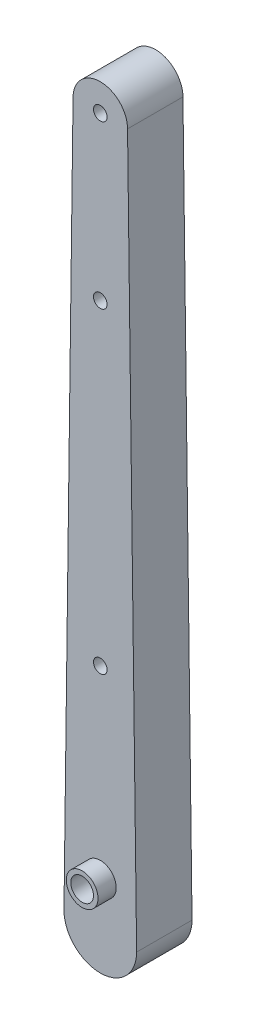
ISO-10303-21;
HEADER;
FILE_DESCRIPTION(('STEP AP214'),'2;1');
FILE_NAME('part.step','',(''),(''),'','','');
FILE_SCHEMA(('AUTOMOTIVE_DESIGN { 1 0 10303 214 1 1 1 1 }'));
ENDSEC;
DATA;
#1=APPLICATION_CONTEXT('core data for automotive mechanical design processes');
#2=APPLICATION_PROTOCOL_DEFINITION('international standard','automotive_design',2000,#1);
#3=PRODUCT_CONTEXT('',#1,'mechanical');
#4=PRODUCT('Part','Part','',(#3));
#5=PRODUCT_RELATED_PRODUCT_CATEGORY('part','',(#4));
#6=PRODUCT_DEFINITION_FORMATION('','',#4);
#7=PRODUCT_DEFINITION_CONTEXT('part definition',#1,'design');
#8=PRODUCT_DEFINITION('design','',#6,#7);
#9=PRODUCT_DEFINITION_SHAPE('','',#8);
#10=(LENGTH_UNIT() NAMED_UNIT(*) SI_UNIT(.MILLI.,.METRE.));
#11=(NAMED_UNIT(*) PLANE_ANGLE_UNIT() SI_UNIT($,.RADIAN.));
#12=(NAMED_UNIT(*) SI_UNIT($,.STERADIAN.) SOLID_ANGLE_UNIT());
#13=UNCERTAINTY_MEASURE_WITH_UNIT(LENGTH_MEASURE(1.E-05),#10,'distance_accuracy_value','');
#14=(GEOMETRIC_REPRESENTATION_CONTEXT(3) GLOBAL_UNCERTAINTY_ASSIGNED_CONTEXT((#13)) GLOBAL_UNIT_ASSIGNED_CONTEXT((#10,
#11,#12)) REPRESENTATION_CONTEXT('',''));
#15=CARTESIAN_POINT('',(0.,0.,0.));
#16=DIRECTION('',(0.,0.,1.));
#17=DIRECTION('',(1.,0.,0.));
#18=AXIS2_PLACEMENT_3D('',#15,#16,#17);
#19=CARTESIAN_POINT('',(0.,-68.,16.2));
#20=DIRECTION('',(0.,0.,1.));
#21=DIRECTION('',(1.,0.,0.));
#22=AXIS2_PLACEMENT_3D('',#19,#20,#21);
#23=PLANE('',#22);
#24=CARTESIAN_POINT('',(0.,-68.,16.2));
#25=DIRECTION('',(0.,0.,1.));
#26=DIRECTION('',(1.,0.,0.));
#27=AXIS2_PLACEMENT_3D('',#24,#25,#26);
#28=CIRCLE('',#27,3.5);
#29=CARTESIAN_POINT('',(3.50000000000002,-68.,16.2));
#30=VERTEX_POINT('',#29);
#31=EDGE_CURVE('E12',#30,#30,#28,.T.);
#32=ORIENTED_EDGE('',*,*,#31,.T.);
#33=EDGE_LOOP('',(#32));
#34=FACE_BOUND('',#33,.T.);
#35=CARTESIAN_POINT('',(0.,-68.,16.2));
#36=DIRECTION('',(0.,0.,1.));
#37=DIRECTION('',(1.,0.,0.));
#38=AXIS2_PLACEMENT_3D('',#35,#36,#37);
#39=CIRCLE('',#38,2.5);
#40=CARTESIAN_POINT('',(2.50000000000002,-68.,16.2));
#41=VERTEX_POINT('',#40);
#42=EDGE_CURVE('E64',#41,#41,#39,.T.);
#43=ORIENTED_EDGE('',*,*,#42,.F.);
#44=EDGE_LOOP('',(#43));
#45=FACE_BOUND('',#44,.T.);
#46=ADVANCED_FACE('F53',(#34,#45),#23,.T.);
#47=CARTESIAN_POINT('',(0.,-68.,12.2));
#48=DIRECTION('',(0.,0.,1.));
#49=DIRECTION('',(1.,0.,0.));
#50=AXIS2_PLACEMENT_3D('',#47,#48,#49);
#51=PLANE('',#50);
#52=CARTESIAN_POINT('',(0.,-68.,12.2));
#53=DIRECTION('',(0.,0.,1.));
#54=DIRECTION('',(1.,0.,0.));
#55=AXIS2_PLACEMENT_3D('',#52,#53,#54);
#56=CIRCLE('',#55,3.5);
#57=CARTESIAN_POINT('',(3.50000000000002,-68.,12.2));
#58=VERTEX_POINT('',#57);
#59=EDGE_CURVE('E57',#58,#58,#56,.T.);
#60=ORIENTED_EDGE('',*,*,#59,.F.);
#61=EDGE_LOOP('',(#60));
#62=FACE_BOUND('',#61,.T.);
#63=CARTESIAN_POINT('',(0.,-68.,12.2));
#64=DIRECTION('',(0.,0.,1.));
#65=DIRECTION('',(1.,0.,0.));
#66=AXIS2_PLACEMENT_3D('',#63,#64,#65);
#67=CIRCLE('',#66,2.5);
#68=CARTESIAN_POINT('',(2.50000000000002,-68.,12.2));
#69=VERTEX_POINT('',#68);
#70=EDGE_CURVE('E66',#69,#69,#67,.T.);
#71=ORIENTED_EDGE('',*,*,#70,.T.);
#72=EDGE_LOOP('',(#71));
#73=FACE_BOUND('',#72,.T.);
#74=ADVANCED_FACE('F76',(#62,#73),#51,.F.);
#75=CARTESIAN_POINT('',(0.,-68.,16.2));
#76=DIRECTION('',(0.,0.,-1.));
#77=DIRECTION('',(-1.,0.,0.));
#78=AXIS2_PLACEMENT_3D('',#75,#76,#77);
#79=CYLINDRICAL_SURFACE('',#78,3.5);
#80=ORIENTED_EDGE('',*,*,#31,.F.);
#81=EDGE_LOOP('',(#80));
#82=FACE_BOUND('',#81,.T.);
#83=ORIENTED_EDGE('',*,*,#59,.T.);
#84=EDGE_LOOP('',(#83));
#85=FACE_BOUND('',#84,.T.);
#86=ADVANCED_FACE('F55',(#82,#85),#79,.T.);
#87=CARTESIAN_POINT('',(0.,-68.,16.2));
#88=DIRECTION('',(0.,0.,-1.));
#89=DIRECTION('',(-1.,0.,0.));
#90=AXIS2_PLACEMENT_3D('',#87,#88,#89);
#91=CYLINDRICAL_SURFACE('',#90,2.5);
#92=ORIENTED_EDGE('',*,*,#42,.T.);
#93=EDGE_LOOP('',(#92));
#94=FACE_BOUND('',#93,.T.);
#95=ORIENTED_EDGE('',*,*,#70,.F.);
#96=EDGE_LOOP('',(#95));
#97=FACE_BOUND('',#96,.T.);
#98=ADVANCED_FACE('F72',(#94,#97),#91,.F.);
#99=CLOSED_SHELL('',(#46,#74,#86,#98));
#100=MANIFOLD_SOLID_BREP('B2',#99);
#101=CARTESIAN_POINT('',(0.,78.,12.2));
#102=DIRECTION('',(0.,0.,1.));
#103=DIRECTION('',(1.,0.,0.));
#104=AXIS2_PLACEMENT_3D('',#101,#102,#103);
#105=PLANE('',#104);
#106=CARTESIAN_POINT('',(0.,42.2627572504078,12.2));
#107=DIRECTION('',(0.,0.,1.));
#108=DIRECTION('',(1.,0.,0.));
#109=AXIS2_PLACEMENT_3D('',#106,#107,#108);
#110=CIRCLE('',#109,1.5);
#111=CARTESIAN_POINT('',(1.5,42.2627572504078,12.2));
#112=VERTEX_POINT('',#111);
#113=EDGE_CURVE('E218',#112,#112,#110,.T.);
#114=ORIENTED_EDGE('',*,*,#113,.F.);
#115=EDGE_LOOP('',(#114));
#116=FACE_BOUND('',#115,.T.);
#117=CARTESIAN_POINT('',(0.,-27.421243353148,12.2));
#118=DIRECTION('',(0.,0.,1.));
#119=DIRECTION('',(1.,0.,0.));
#120=AXIS2_PLACEMENT_3D('',#117,#118,#119);
#121=CIRCLE('',#120,1.5);
#122=CARTESIAN_POINT('',(1.5,-27.421243353148,12.2));
#123=VERTEX_POINT('',#122);
#124=EDGE_CURVE('E225',#123,#123,#121,.T.);
#125=ORIENTED_EDGE('',*,*,#124,.F.);
#126=EDGE_LOOP('',(#125));
#127=FACE_BOUND('',#126,.T.);
#128=CARTESIAN_POINT('',(0.,78.,12.2));
#129=DIRECTION('',(0.,0.,1.));
#130=DIRECTION('',(1.,0.,0.));
#131=AXIS2_PLACEMENT_3D('',#128,#129,#130);
#132=CIRCLE('',#131,1.5);
#133=CARTESIAN_POINT('',(1.5,78.,12.2));
#134=VERTEX_POINT('',#133);
#135=EDGE_CURVE('E188',#134,#134,#132,.T.);
#136=ORIENTED_EDGE('',*,*,#135,.F.);
#137=EDGE_LOOP('',(#136));
#138=FACE_BOUND('',#137,.T.);
#139=CARTESIAN_POINT('',(0.,78.,12.2));
#140=DIRECTION('',(0.,0.,1.));
#141=DIRECTION('',(1.,0.,0.));
#142=AXIS2_PLACEMENT_3D('',#139,#140,#141);
#143=CIRCLE('',#142,6.);
#144=CARTESIAN_POINT('',(6.,78.,12.2));
#145=VERTEX_POINT('',#144);
#146=CARTESIAN_POINT('',(-6.,78.,12.2));
#147=VERTEX_POINT('',#146);
#148=EDGE_CURVE('E168',#145,#147,#143,.T.);
#149=ORIENTED_EDGE('',*,*,#148,.T.);
#150=DIRECTION('',(-0.0128194593250657,-0.999917827355135,0.));
#151=VECTOR('',#150,1.);
#152=CARTESIAN_POINT('',(-6.,78.,12.2));
#153=LINE('',#152,#151);
#154=CARTESIAN_POINT('',(-7.99999999999995,-78.,12.2));
#155=VERTEX_POINT('',#154);
#156=EDGE_CURVE('E163',#147,#155,#153,.T.);
#157=ORIENTED_EDGE('',*,*,#156,.T.);
#158=CARTESIAN_POINT('',(0.,-78.,12.2));
#159=DIRECTION('',(0.,0.,1.));
#160=DIRECTION('',(1.,0.,0.));
#161=AXIS2_PLACEMENT_3D('',#158,#159,#160);
#162=CIRCLE('',#161,8.);
#163=CARTESIAN_POINT('',(8.00000000000002,-78.,12.2));
#164=VERTEX_POINT('',#163);
#165=EDGE_CURVE('E166',#155,#164,#162,.T.);
#166=ORIENTED_EDGE('',*,*,#165,.T.);
#167=DIRECTION('',(-0.012819459325066,0.999917827355135,0.));
#168=VECTOR('',#167,1.);
#169=CARTESIAN_POINT('',(6.,78.,12.2));
#170=LINE('',#169,#168);
#171=EDGE_CURVE('E133',#164,#145,#170,.T.);
#172=ORIENTED_EDGE('',*,*,#171,.T.);
#173=EDGE_LOOP('',(#149,#157,#166,#172));
#174=FACE_BOUND('',#173,.T.);
#175=CARTESIAN_POINT('',(0.,-68.,12.2));
#176=DIRECTION('',(0.,0.,1.));
#177=DIRECTION('',(1.,0.,0.));
#178=AXIS2_PLACEMENT_3D('',#175,#176,#177);
#179=CIRCLE('',#178,2.5);
#180=CARTESIAN_POINT('',(2.50000000000002,-68.,12.2));
#181=VERTEX_POINT('',#180);
#182=EDGE_CURVE('E210',#181,#181,#179,.T.);
#183=ORIENTED_EDGE('',*,*,#182,.F.);
#184=EDGE_LOOP('',(#183));
#185=FACE_BOUND('',#184,.T.);
#186=ADVANCED_FACE('F115',(#116,#127,#138,#174,#185),#105,.T.);
#187=CARTESIAN_POINT('',(0.,78.,0.));
#188=DIRECTION('',(0.,0.,1.));
#189=DIRECTION('',(1.,0.,0.));
#190=AXIS2_PLACEMENT_3D('',#187,#188,#189);
#191=PLANE('',#190);
#192=CARTESIAN_POINT('',(0.,42.2627572504078,0.));
#193=DIRECTION('',(0.,0.,-1.));
#194=DIRECTION('',(-1.,0.,0.));
#195=AXIS2_PLACEMENT_3D('',#192,#193,#194);
#196=CIRCLE('',#195,1.5);
#197=CARTESIAN_POINT('',(-1.5,42.2627572504078,0.));
#198=VERTEX_POINT('',#197);
#199=EDGE_CURVE('E229',#198,#198,#196,.T.);
#200=ORIENTED_EDGE('',*,*,#199,.F.);
#201=EDGE_LOOP('',(#200));
#202=FACE_BOUND('',#201,.T.);
#203=CARTESIAN_POINT('',(0.,-27.421243353148,0.));
#204=DIRECTION('',(0.,0.,-1.));
#205=DIRECTION('',(-1.,0.,0.));
#206=AXIS2_PLACEMENT_3D('',#203,#204,#205);
#207=CIRCLE('',#206,1.5);
#208=CARTESIAN_POINT('',(-1.5,-27.421243353148,0.));
#209=VERTEX_POINT('',#208);
#210=EDGE_CURVE('E230',#209,#209,#207,.T.);
#211=ORIENTED_EDGE('',*,*,#210,.F.);
#212=EDGE_LOOP('',(#211));
#213=FACE_BOUND('',#212,.T.);
#214=CARTESIAN_POINT('',(0.,78.,0.));
#215=DIRECTION('',(0.,0.,1.));
#216=DIRECTION('',(1.,0.,0.));
#217=AXIS2_PLACEMENT_3D('',#214,#215,#216);
#218=CIRCLE('',#217,6.);
#219=CARTESIAN_POINT('',(6.,78.,0.));
#220=VERTEX_POINT('',#219);
#221=CARTESIAN_POINT('',(-6.,78.,0.));
#222=VERTEX_POINT('',#221);
#223=EDGE_CURVE('E184',#220,#222,#218,.T.);
#224=ORIENTED_EDGE('',*,*,#223,.F.);
#225=DIRECTION('',(-0.012819459325066,0.999917827355135,0.));
#226=VECTOR('',#225,1.);
#227=CARTESIAN_POINT('',(6.,78.,0.));
#228=LINE('',#227,#226);
#229=CARTESIAN_POINT('',(8.00000000000002,-78.,0.));
#230=VERTEX_POINT('',#229);
#231=EDGE_CURVE('E156',#230,#220,#228,.T.);
#232=ORIENTED_EDGE('',*,*,#231,.F.);
#233=CARTESIAN_POINT('',(0.,-78.,0.));
#234=DIRECTION('',(0.,0.,1.));
#235=DIRECTION('',(1.,0.,0.));
#236=AXIS2_PLACEMENT_3D('',#233,#234,#235);
#237=CIRCLE('',#236,8.);
#238=CARTESIAN_POINT('',(-7.99999999999995,-78.,0.));
#239=VERTEX_POINT('',#238);
#240=EDGE_CURVE('E150',#239,#230,#237,.T.);
#241=ORIENTED_EDGE('',*,*,#240,.F.);
#242=DIRECTION('',(-0.0128194593250657,-0.999917827355135,0.));
#243=VECTOR('',#242,1.);
#244=CARTESIAN_POINT('',(-6.,78.,0.));
#245=LINE('',#244,#243);
#246=EDGE_CURVE('E173',#222,#239,#245,.T.);
#247=ORIENTED_EDGE('',*,*,#246,.F.);
#248=EDGE_LOOP('',(#224,#232,#241,#247));
#249=FACE_BOUND('',#248,.T.);
#250=CARTESIAN_POINT('',(0.,78.,0.));
#251=DIRECTION('',(0.,0.,1.));
#252=DIRECTION('',(1.,0.,0.));
#253=AXIS2_PLACEMENT_3D('',#250,#251,#252);
#254=CIRCLE('',#253,1.5);
#255=CARTESIAN_POINT('',(1.5,78.,0.));
#256=VERTEX_POINT('',#255);
#257=EDGE_CURVE('E206',#256,#256,#254,.T.);
#258=ORIENTED_EDGE('',*,*,#257,.T.);
#259=EDGE_LOOP('',(#258));
#260=FACE_BOUND('',#259,.T.);
#261=CARTESIAN_POINT('',(0.,-68.,0.));
#262=DIRECTION('',(0.,0.,1.));
#263=DIRECTION('',(1.,0.,0.));
#264=AXIS2_PLACEMENT_3D('',#261,#262,#263);
#265=CIRCLE('',#264,2.5);
#266=CARTESIAN_POINT('',(2.50000000000002,-68.,0.));
#267=VERTEX_POINT('',#266);
#268=EDGE_CURVE('E214',#267,#267,#265,.T.);
#269=ORIENTED_EDGE('',*,*,#268,.T.);
#270=EDGE_LOOP('',(#269));
#271=FACE_BOUND('',#270,.T.);
#272=ADVANCED_FACE('F201',(#202,#213,#249,#260,#271),#191,.F.);
#273=CARTESIAN_POINT('',(0.,78.,12.2));
#274=DIRECTION('',(0.,0.,-1.));
#275=DIRECTION('',(-1.,0.,0.));
#276=AXIS2_PLACEMENT_3D('',#273,#274,#275);
#277=CYLINDRICAL_SURFACE('',#276,6.);
#278=ORIENTED_EDGE('',*,*,#223,.T.);
#279=DIRECTION('',(0.,0.,-1.));
#280=VECTOR('',#279,1.);
#281=CARTESIAN_POINT('',(-6.,78.,12.2));
#282=LINE('',#281,#280);
#283=EDGE_CURVE('E51',#147,#222,#282,.T.);
#284=ORIENTED_EDGE('',*,*,#283,.F.);
#285=ORIENTED_EDGE('',*,*,#148,.F.);
#286=DIRECTION('',(0.,0.,-1.));
#287=VECTOR('',#286,1.);
#288=CARTESIAN_POINT('',(6.,78.,12.2));
#289=LINE('',#288,#287);
#290=EDGE_CURVE('E180',#145,#220,#289,.T.);
#291=ORIENTED_EDGE('',*,*,#290,.T.);
#292=EDGE_LOOP('',(#278,#284,#285,#291));
#293=FACE_BOUND('',#292,.T.);
#294=ADVANCED_FACE('F117',(#293),#277,.T.);
#295=CARTESIAN_POINT('',(-6.,78.,12.2));
#296=DIRECTION('',(0.999917827355135,-0.0128194593250657,0.));
#297=DIRECTION('',(0.0128194593250657,0.999917827355135,0.));
#298=AXIS2_PLACEMENT_3D('',#295,#296,#297);
#299=PLANE('',#298);
#300=ORIENTED_EDGE('',*,*,#246,.T.);
#301=DIRECTION('',(0.,0.,-1.));
#302=VECTOR('',#301,1.);
#303=CARTESIAN_POINT('',(-7.99999999999995,-78.,12.2));
#304=LINE('',#303,#302);
#305=EDGE_CURVE('E125',#155,#239,#304,.T.);
#306=ORIENTED_EDGE('',*,*,#305,.F.);
#307=ORIENTED_EDGE('',*,*,#156,.F.);
#308=ORIENTED_EDGE('',*,*,#283,.T.);
#309=EDGE_LOOP('',(#300,#306,#307,#308));
#310=FACE_BOUND('',#309,.T.);
#311=ADVANCED_FACE('F172',(#310),#299,.F.);
#312=CARTESIAN_POINT('',(0.,-78.,12.2));
#313=DIRECTION('',(0.,0.,-1.));
#314=DIRECTION('',(-1.,0.,0.));
#315=AXIS2_PLACEMENT_3D('',#312,#313,#314);
#316=CYLINDRICAL_SURFACE('',#315,8.);
#317=ORIENTED_EDGE('',*,*,#240,.T.);
#318=DIRECTION('',(0.,0.,-1.));
#319=VECTOR('',#318,1.);
#320=CARTESIAN_POINT('',(8.00000000000002,-78.,12.2));
#321=LINE('',#320,#319);
#322=EDGE_CURVE('E175',#164,#230,#321,.T.);
#323=ORIENTED_EDGE('',*,*,#322,.F.);
#324=ORIENTED_EDGE('',*,*,#165,.F.);
#325=ORIENTED_EDGE('',*,*,#305,.T.);
#326=EDGE_LOOP('',(#317,#323,#324,#325));
#327=FACE_BOUND('',#326,.T.);
#328=ADVANCED_FACE('F176',(#327),#316,.T.);
#329=CARTESIAN_POINT('',(6.,78.,12.2));
#330=DIRECTION('',(-0.999917827355135,-0.012819459325066,0.));
#331=DIRECTION('',(0.012819459325066,-0.999917827355135,0.));
#332=AXIS2_PLACEMENT_3D('',#329,#330,#331);
#333=PLANE('',#332);
#334=ORIENTED_EDGE('',*,*,#231,.T.);
#335=ORIENTED_EDGE('',*,*,#290,.F.);
#336=ORIENTED_EDGE('',*,*,#171,.F.);
#337=ORIENTED_EDGE('',*,*,#322,.T.);
#338=EDGE_LOOP('',(#334,#335,#336,#337));
#339=FACE_BOUND('',#338,.T.);
#340=ADVANCED_FACE('F198',(#339),#333,.F.);
#341=CARTESIAN_POINT('',(0.,78.,12.2));
#342=DIRECTION('',(0.,0.,-1.));
#343=DIRECTION('',(-1.,0.,0.));
#344=AXIS2_PLACEMENT_3D('',#341,#342,#343);
#345=CYLINDRICAL_SURFACE('',#344,1.5);
#346=ORIENTED_EDGE('',*,*,#135,.T.);
#347=EDGE_LOOP('',(#346));
#348=FACE_BOUND('',#347,.T.);
#349=ORIENTED_EDGE('',*,*,#257,.F.);
#350=EDGE_LOOP('',(#349));
#351=FACE_BOUND('',#350,.T.);
#352=ADVANCED_FACE('F256',(#348,#351),#345,.F.);
#353=CARTESIAN_POINT('',(0.,-68.,12.2));
#354=DIRECTION('',(0.,0.,-1.));
#355=DIRECTION('',(-1.,0.,0.));
#356=AXIS2_PLACEMENT_3D('',#353,#354,#355);
#357=CYLINDRICAL_SURFACE('',#356,2.5);
#358=ORIENTED_EDGE('',*,*,#182,.T.);
#359=EDGE_LOOP('',(#358));
#360=FACE_BOUND('',#359,.T.);
#361=ORIENTED_EDGE('',*,*,#268,.F.);
#362=EDGE_LOOP('',(#361));
#363=FACE_BOUND('',#362,.T.);
#364=ADVANCED_FACE('F247',(#360,#363),#357,.F.);
#365=CARTESIAN_POINT('',(0.,-27.421243353148,20.));
#366=DIRECTION('',(0.,0.,-1.));
#367=DIRECTION('',(-1.,0.,0.));
#368=AXIS2_PLACEMENT_3D('',#365,#366,#367);
#369=CYLINDRICAL_SURFACE('',#368,1.5);
#370=ORIENTED_EDGE('',*,*,#124,.T.);
#371=EDGE_LOOP('',(#370));
#372=FACE_BOUND('',#371,.T.);
#373=ORIENTED_EDGE('',*,*,#210,.T.);
#374=EDGE_LOOP('',(#373));
#375=FACE_BOUND('',#374,.T.);
#376=ADVANCED_FACE('F245',(#372,#375),#369,.F.);
#377=CARTESIAN_POINT('',(0.,42.2627572504078,20.));
#378=DIRECTION('',(0.,0.,-1.));
#379=DIRECTION('',(-1.,0.,0.));
#380=AXIS2_PLACEMENT_3D('',#377,#378,#379);
#381=CYLINDRICAL_SURFACE('',#380,1.5);
#382=ORIENTED_EDGE('',*,*,#113,.T.);
#383=EDGE_LOOP('',(#382));
#384=FACE_BOUND('',#383,.T.);
#385=ORIENTED_EDGE('',*,*,#199,.T.);
#386=EDGE_LOOP('',(#385));
#387=FACE_BOUND('',#386,.T.);
#388=ADVANCED_FACE('F238',(#384,#387),#381,.F.);
#389=CLOSED_SHELL('',(#186,#272,#294,#311,#328,#340,#352,#364,#376,#388));
#390=MANIFOLD_SOLID_BREP('B7',#389);
#391=ADVANCED_BREP_SHAPE_REPRESENTATION('',(#18,#100,#390),#14);
#392=SHAPE_DEFINITION_REPRESENTATION(#9,#391);
ENDSEC;
END-ISO-10303-21;
